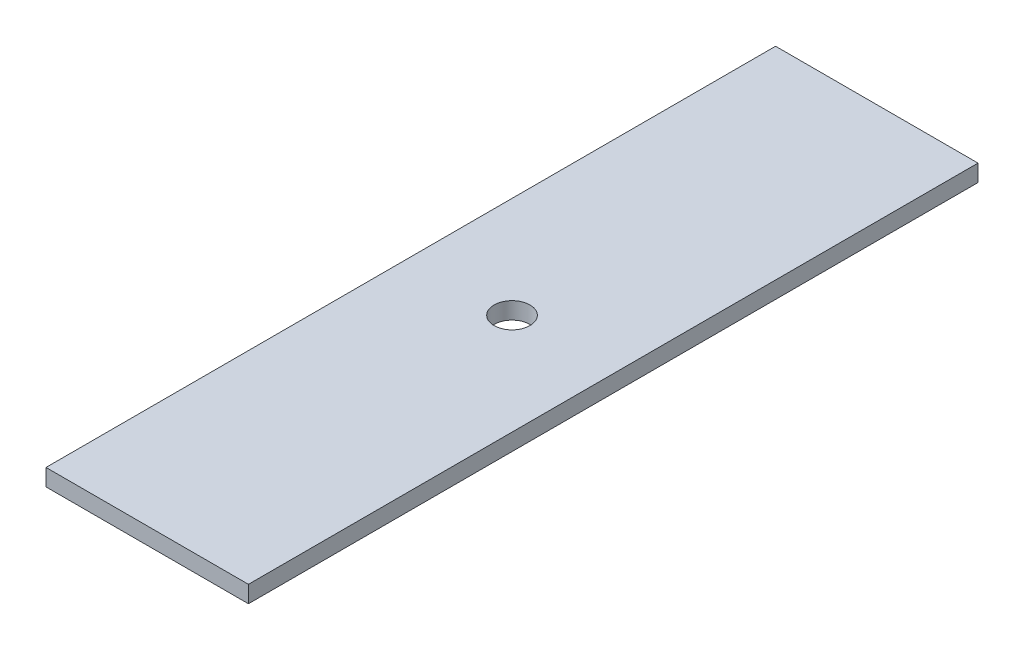
ISO-10303-21;
HEADER;
FILE_DESCRIPTION(('STEP AP214'),'2;1');
FILE_NAME('part.step','',(''),(''),'','','');
FILE_SCHEMA(('AUTOMOTIVE_DESIGN { 1 0 10303 214 1 1 1 1 }'));
ENDSEC;
DATA;
#1=APPLICATION_CONTEXT('core data for automotive mechanical design processes');
#2=APPLICATION_PROTOCOL_DEFINITION('international standard','automotive_design',2000,#1);
#3=PRODUCT_CONTEXT('',#1,'mechanical');
#4=PRODUCT('Part','Part','',(#3));
#5=PRODUCT_RELATED_PRODUCT_CATEGORY('part','',(#4));
#6=PRODUCT_DEFINITION_FORMATION('','',#4);
#7=PRODUCT_DEFINITION_CONTEXT('part definition',#1,'design');
#8=PRODUCT_DEFINITION('design','',#6,#7);
#9=PRODUCT_DEFINITION_SHAPE('','',#8);
#10=(LENGTH_UNIT() NAMED_UNIT(*) SI_UNIT(.MILLI.,.METRE.));
#11=(NAMED_UNIT(*) PLANE_ANGLE_UNIT() SI_UNIT($,.RADIAN.));
#12=(NAMED_UNIT(*) SI_UNIT($,.STERADIAN.) SOLID_ANGLE_UNIT());
#13=UNCERTAINTY_MEASURE_WITH_UNIT(LENGTH_MEASURE(1.E-05),#10,'distance_accuracy_value','');
#14=(GEOMETRIC_REPRESENTATION_CONTEXT(3) GLOBAL_UNCERTAINTY_ASSIGNED_CONTEXT((#13)) GLOBAL_UNIT_ASSIGNED_CONTEXT((#10,
#11,#12)) REPRESENTATION_CONTEXT('',''));
#15=CARTESIAN_POINT('',(0.,0.,0.));
#16=DIRECTION('',(0.,0.,1.));
#17=DIRECTION('',(1.,0.,0.));
#18=AXIS2_PLACEMENT_3D('',#15,#16,#17);
#19=CARTESIAN_POINT('',(-38.1,6.35,137.31875));
#20=DIRECTION('',(1.,0.,0.));
#21=DIRECTION('',(0.,0.,-1.));
#22=AXIS2_PLACEMENT_3D('',#19,#20,#21);
#23=PLANE('',#22);
#24=DIRECTION('',(0.,0.,1.));
#25=VECTOR('',#24,1.);
#26=CARTESIAN_POINT('',(-38.1,0.,137.31875));
#27=LINE('',#26,#25);
#28=CARTESIAN_POINT('',(-38.1,0.,-137.31875));
#29=VERTEX_POINT('',#28);
#30=CARTESIAN_POINT('',(-38.1,0.,137.31875));
#31=VERTEX_POINT('',#30);
#32=EDGE_CURVE('E95',#29,#31,#27,.T.);
#33=ORIENTED_EDGE('',*,*,#32,.T.);
#34=DIRECTION('',(0.,-1.,0.));
#35=VECTOR('',#34,1.);
#36=CARTESIAN_POINT('',(-38.1,6.35,137.31875));
#37=LINE('',#36,#35);
#38=CARTESIAN_POINT('',(-38.1,6.35,137.31875));
#39=VERTEX_POINT('',#38);
#40=EDGE_CURVE('E11',#39,#31,#37,.T.);
#41=ORIENTED_EDGE('',*,*,#40,.F.);
#42=DIRECTION('',(0.,0.,1.));
#43=VECTOR('',#42,1.);
#44=CARTESIAN_POINT('',(-38.1,6.35,137.31875));
#45=LINE('',#44,#43);
#46=CARTESIAN_POINT('',(-38.1,6.35,-137.31875));
#47=VERTEX_POINT('',#46);
#48=EDGE_CURVE('E83',#47,#39,#45,.T.);
#49=ORIENTED_EDGE('',*,*,#48,.F.);
#50=DIRECTION('',(0.,-1.,0.));
#51=VECTOR('',#50,1.);
#52=CARTESIAN_POINT('',(-38.1,6.35,-137.31875));
#53=LINE('',#52,#51);
#54=EDGE_CURVE('E91',#47,#29,#53,.T.);
#55=ORIENTED_EDGE('',*,*,#54,.T.);
#56=EDGE_LOOP('',(#33,#41,#49,#55));
#57=FACE_BOUND('',#56,.T.);
#58=ADVANCED_FACE('F32',(#57),#23,.F.);
#59=CARTESIAN_POINT('',(38.1,6.35,137.31875));
#60=DIRECTION('',(0.,0.,-1.));
#61=DIRECTION('',(-1.,0.,0.));
#62=AXIS2_PLACEMENT_3D('',#59,#60,#61);
#63=PLANE('',#62);
#64=DIRECTION('',(1.,0.,0.));
#65=VECTOR('',#64,1.);
#66=CARTESIAN_POINT('',(38.1,0.,137.31875));
#67=LINE('',#66,#65);
#68=CARTESIAN_POINT('',(38.1,0.,137.31875));
#69=VERTEX_POINT('',#68);
#70=EDGE_CURVE('E87',#31,#69,#67,.T.);
#71=ORIENTED_EDGE('',*,*,#70,.T.);
#72=DIRECTION('',(0.,-1.,0.));
#73=VECTOR('',#72,1.);
#74=CARTESIAN_POINT('',(38.1,6.35,137.31875));
#75=LINE('',#74,#73);
#76=CARTESIAN_POINT('',(38.1,6.35,137.31875));
#77=VERTEX_POINT('',#76);
#78=EDGE_CURVE('E40',#77,#69,#75,.T.);
#79=ORIENTED_EDGE('',*,*,#78,.F.);
#80=DIRECTION('',(1.,0.,0.));
#81=VECTOR('',#80,1.);
#82=CARTESIAN_POINT('',(38.1,6.35,137.31875));
#83=LINE('',#82,#81);
#84=EDGE_CURVE('E78',#39,#77,#83,.T.);
#85=ORIENTED_EDGE('',*,*,#84,.F.);
#86=ORIENTED_EDGE('',*,*,#40,.T.);
#87=EDGE_LOOP('',(#71,#79,#85,#86));
#88=FACE_BOUND('',#87,.T.);
#89=ADVANCED_FACE('F86',(#88),#63,.F.);
#90=CARTESIAN_POINT('',(38.1,6.35,137.31875));
#91=DIRECTION('',(-1.,0.,0.));
#92=DIRECTION('',(0.,0.,1.));
#93=AXIS2_PLACEMENT_3D('',#90,#91,#92);
#94=PLANE('',#93);
#95=DIRECTION('',(0.,0.,-1.));
#96=VECTOR('',#95,1.);
#97=CARTESIAN_POINT('',(38.1,0.,137.31875));
#98=LINE('',#97,#96);
#99=CARTESIAN_POINT('',(38.1,0.,-137.31875));
#100=VERTEX_POINT('',#99);
#101=EDGE_CURVE('E65',#69,#100,#98,.T.);
#102=ORIENTED_EDGE('',*,*,#101,.T.);
#103=DIRECTION('',(0.,-1.,0.));
#104=VECTOR('',#103,1.);
#105=CARTESIAN_POINT('',(38.1,6.35,-137.31875));
#106=LINE('',#105,#104);
#107=CARTESIAN_POINT('',(38.1,6.35,-137.31875));
#108=VERTEX_POINT('',#107);
#109=EDGE_CURVE('E88',#108,#100,#106,.T.);
#110=ORIENTED_EDGE('',*,*,#109,.F.);
#111=DIRECTION('',(0.,0.,-1.));
#112=VECTOR('',#111,1.);
#113=CARTESIAN_POINT('',(38.1,6.35,137.31875));
#114=LINE('',#113,#112);
#115=EDGE_CURVE('E81',#77,#108,#114,.T.);
#116=ORIENTED_EDGE('',*,*,#115,.F.);
#117=ORIENTED_EDGE('',*,*,#78,.T.);
#118=EDGE_LOOP('',(#102,#110,#116,#117));
#119=FACE_BOUND('',#118,.T.);
#120=ADVANCED_FACE('F89',(#119),#94,.F.);
#121=CARTESIAN_POINT('',(38.1,6.35,-137.31875));
#122=DIRECTION('',(0.,0.,1.));
#123=DIRECTION('',(1.,0.,0.));
#124=AXIS2_PLACEMENT_3D('',#121,#122,#123);
#125=PLANE('',#124);
#126=DIRECTION('',(-1.,0.,0.));
#127=VECTOR('',#126,1.);
#128=CARTESIAN_POINT('',(38.1,0.,-137.31875));
#129=LINE('',#128,#127);
#130=EDGE_CURVE('E71',#100,#29,#129,.T.);
#131=ORIENTED_EDGE('',*,*,#130,.T.);
#132=ORIENTED_EDGE('',*,*,#54,.F.);
#133=DIRECTION('',(-1.,0.,0.));
#134=VECTOR('',#133,1.);
#135=CARTESIAN_POINT('',(38.1,6.35,-137.31875));
#136=LINE('',#135,#134);
#137=EDGE_CURVE('E48',#108,#47,#136,.T.);
#138=ORIENTED_EDGE('',*,*,#137,.F.);
#139=ORIENTED_EDGE('',*,*,#109,.T.);
#140=EDGE_LOOP('',(#131,#132,#138,#139));
#141=FACE_BOUND('',#140,.T.);
#142=ADVANCED_FACE('F103',(#141),#125,.F.);
#143=CARTESIAN_POINT('',(0.,6.35,0.));
#144=DIRECTION('',(0.,1.,0.));
#145=DIRECTION('',(0.,0.,1.));
#146=AXIS2_PLACEMENT_3D('',#143,#144,#145);
#147=PLANE('',#146);
#148=CARTESIAN_POINT('',(-2.4978525791662E-13,6.35,0.));
#149=DIRECTION('',(0.,-1.,0.));
#150=DIRECTION('',(0.,0.,-1.));
#151=AXIS2_PLACEMENT_3D('',#148,#149,#150);
#152=CIRCLE('',#151,6.74623999999999);
#153=CARTESIAN_POINT('',(-2.4978525791662E-13,6.35,-6.74623999999991));
#154=VERTEX_POINT('',#153);
#155=EDGE_CURVE('E98',#154,#154,#152,.T.);
#156=ORIENTED_EDGE('',*,*,#155,.T.);
#157=EDGE_LOOP('',(#156));
#158=FACE_BOUND('',#157,.T.);
#159=ORIENTED_EDGE('',*,*,#48,.T.);
#160=ORIENTED_EDGE('',*,*,#84,.T.);
#161=ORIENTED_EDGE('',*,*,#115,.T.);
#162=ORIENTED_EDGE('',*,*,#137,.T.);
#163=EDGE_LOOP('',(#159,#160,#161,#162));
#164=FACE_BOUND('',#163,.T.);
#165=ADVANCED_FACE('F79',(#158,#164),#147,.T.);
#166=CARTESIAN_POINT('',(0.,0.,0.));
#167=DIRECTION('',(0.,1.,0.));
#168=DIRECTION('',(0.,0.,1.));
#169=AXIS2_PLACEMENT_3D('',#166,#167,#168);
#170=PLANE('',#169);
#171=CARTESIAN_POINT('',(-2.4978525791662E-13,0.,0.));
#172=DIRECTION('',(0.,-1.,0.));
#173=DIRECTION('',(0.,0.,-1.));
#174=AXIS2_PLACEMENT_3D('',#171,#172,#173);
#175=CIRCLE('',#174,6.74623999999999);
#176=CARTESIAN_POINT('',(-2.4978525791662E-13,0.,-6.74623999999991));
#177=VERTEX_POINT('',#176);
#178=EDGE_CURVE('E109',#177,#177,#175,.T.);
#179=ORIENTED_EDGE('',*,*,#178,.F.);
#180=EDGE_LOOP('',(#179));
#181=FACE_BOUND('',#180,.T.);
#182=ORIENTED_EDGE('',*,*,#32,.F.);
#183=ORIENTED_EDGE('',*,*,#130,.F.);
#184=ORIENTED_EDGE('',*,*,#101,.F.);
#185=ORIENTED_EDGE('',*,*,#70,.F.);
#186=EDGE_LOOP('',(#182,#183,#184,#185));
#187=FACE_BOUND('',#186,.T.);
#188=ADVANCED_FACE('F106',(#181,#187),#170,.F.);
#189=CARTESIAN_POINT('',(-2.4978525791662E-13,6.35,0.));
#190=DIRECTION('',(0.,-1.,0.));
#191=DIRECTION('',(0.,0.,-1.));
#192=AXIS2_PLACEMENT_3D('',#189,#190,#191);
#193=CYLINDRICAL_SURFACE('',#192,6.74623999999999);
#194=ORIENTED_EDGE('',*,*,#155,.F.);
#195=EDGE_LOOP('',(#194));
#196=FACE_BOUND('',#195,.T.);
#197=ORIENTED_EDGE('',*,*,#178,.T.);
#198=EDGE_LOOP('',(#197));
#199=FACE_BOUND('',#198,.T.);
#200=ADVANCED_FACE('F116',(#196,#199),#193,.F.);
#201=CLOSED_SHELL('',(#58,#89,#120,#142,#165,#188,#200));
#202=MANIFOLD_SOLID_BREP('B2',#201);
#203=ADVANCED_BREP_SHAPE_REPRESENTATION('',(#18,#202),#14);
#204=SHAPE_DEFINITION_REPRESENTATION(#9,#203);
ENDSEC;
END-ISO-10303-21;
